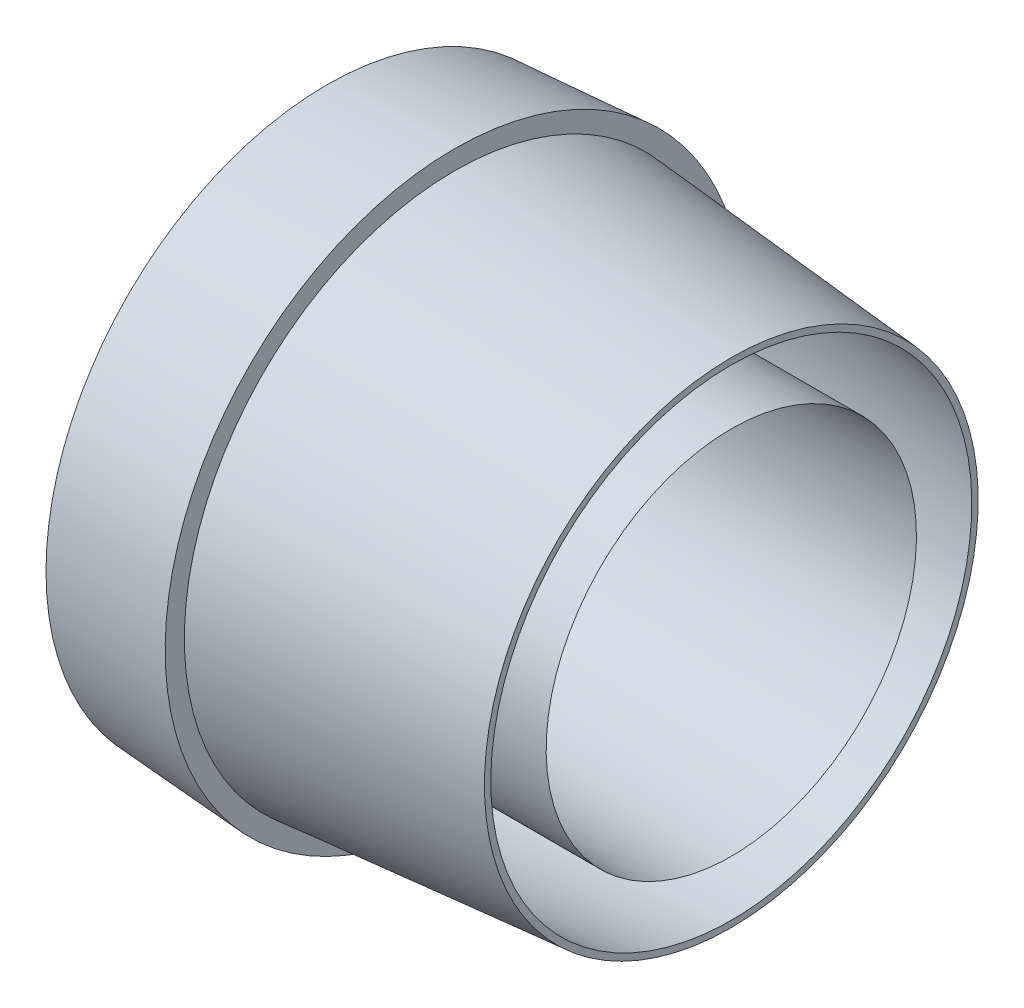
ISO-10303-21;
HEADER;
FILE_DESCRIPTION(('STEP AP214'),'2;1');
FILE_NAME('part.step','',(''),(''),'','','');
FILE_SCHEMA(('AUTOMOTIVE_DESIGN { 1 0 10303 214 1 1 1 1 }'));
ENDSEC;
DATA;
#1=APPLICATION_CONTEXT('core data for automotive mechanical design processes');
#2=APPLICATION_PROTOCOL_DEFINITION('international standard','automotive_design',2000,#1);
#3=PRODUCT_CONTEXT('',#1,'mechanical');
#4=PRODUCT('Part','Part','',(#3));
#5=PRODUCT_RELATED_PRODUCT_CATEGORY('part','',(#4));
#6=PRODUCT_DEFINITION_FORMATION('','',#4);
#7=PRODUCT_DEFINITION_CONTEXT('part definition',#1,'design');
#8=PRODUCT_DEFINITION('design','',#6,#7);
#9=PRODUCT_DEFINITION_SHAPE('','',#8);
#10=(LENGTH_UNIT() NAMED_UNIT(*) SI_UNIT(.MILLI.,.METRE.));
#11=(NAMED_UNIT(*) PLANE_ANGLE_UNIT() SI_UNIT($,.RADIAN.));
#12=(NAMED_UNIT(*) SI_UNIT($,.STERADIAN.) SOLID_ANGLE_UNIT());
#13=UNCERTAINTY_MEASURE_WITH_UNIT(LENGTH_MEASURE(1.E-05),#10,'distance_accuracy_value','');
#14=(GEOMETRIC_REPRESENTATION_CONTEXT(3) GLOBAL_UNCERTAINTY_ASSIGNED_CONTEXT((#13)) GLOBAL_UNIT_ASSIGNED_CONTEXT((#10,
#11,#12)) REPRESENTATION_CONTEXT('',''));
#15=CARTESIAN_POINT('',(0.,0.,0.));
#16=DIRECTION('',(0.,0.,1.));
#17=DIRECTION('',(1.,0.,0.));
#18=AXIS2_PLACEMENT_3D('',#15,#16,#17);
#19=CARTESIAN_POINT('',(3700.,0.,0.));
#20=DIRECTION('',(1.,0.,0.));
#21=DIRECTION('',(0.,0.,-1.));
#22=AXIS2_PLACEMENT_3D('',#19,#20,#21);
#23=CONICAL_SURFACE('',#22,420.,0.0230728278901438);
#24=CARTESIAN_POINT('',(3700.,0.,0.));
#25=DIRECTION('',(-1.,0.,0.));
#26=DIRECTION('',(0.,0.,1.));
#27=AXIS2_PLACEMENT_3D('',#24,#25,#26);
#28=CIRCLE('',#27,420.);
#29=CARTESIAN_POINT('',(3700.,420.,-3.01542614506695E-06));
#30=VERTEX_POINT('',#29);
#31=CARTESIAN_POINT('',(3700.,420.,0.));
#32=VERTEX_POINT('',#31);
#33=EDGE_CURVE('E12',#30,#32,#28,.T.);
#34=ORIENTED_EDGE('',*,*,#33,.T.);
#35=DIRECTION('',(0.999733834114794,0.0230707807872643,0.));
#36=VECTOR('',#35,1.);
#37=CARTESIAN_POINT('',(4350.,435.,0.));
#38=LINE('',#37,#36);
#39=CARTESIAN_POINT('',(4350.,435.,0.));
#40=VERTEX_POINT('',#39);
#41=EDGE_CURVE('E96',#32,#40,#38,.T.);
#42=ORIENTED_EDGE('',*,*,#41,.T.);
#43=CARTESIAN_POINT('',(4350.,0.,0.));
#44=DIRECTION('',(-1.,0.,0.));
#45=DIRECTION('',(0.,0.,1.));
#46=AXIS2_PLACEMENT_3D('',#43,#44,#45);
#47=CIRCLE('',#46,435.);
#48=CARTESIAN_POINT('',(4350.,435.,-3.1231199359622E-06));
#49=VERTEX_POINT('',#48);
#50=EDGE_CURVE('E83',#49,#40,#47,.T.);
#51=ORIENTED_EDGE('',*,*,#50,.F.);
#52=DIRECTION('',(0.999733834114794,0.0230707807872643,-1.65638656126251E-10));
#53=VECTOR('',#52,1.);
#54=CARTESIAN_POINT('',(4350.,435.,-3.1231199359622E-06));
#55=LINE('',#54,#53);
#56=EDGE_CURVE('E105',#30,#49,#55,.T.);
#57=ORIENTED_EDGE('',*,*,#56,.F.);
#58=EDGE_LOOP('',(#34,#42,#51,#57));
#59=FACE_BOUND('',#58,.T.);
#60=ADVANCED_FACE('F49',(#59),#23,.F.);
#61=CARTESIAN_POINT('',(3700.,420.,-3.01542614506695E-06));
#62=DIRECTION('',(1.,0.,0.));
#63=DIRECTION('',(0.,0.,-1.));
#64=AXIS2_PLACEMENT_3D('',#61,#62,#63);
#65=PLANE('',#64);
#66=CARTESIAN_POINT('',(3700.,0.,0.));
#67=DIRECTION('',(-1.,0.,0.));
#68=DIRECTION('',(0.,0.,1.));
#69=AXIS2_PLACEMENT_3D('',#66,#67,#68);
#70=CIRCLE('',#69,435.);
#71=CARTESIAN_POINT('',(3700.,435.,-3.1231199359622E-06));
#72=VERTEX_POINT('',#71);
#73=CARTESIAN_POINT('',(3700.,435.,0.));
#74=VERTEX_POINT('',#73);
#75=EDGE_CURVE('E59',#72,#74,#70,.T.);
#76=ORIENTED_EDGE('',*,*,#75,.T.);
#77=DIRECTION('',(0.,-1.,0.));
#78=VECTOR('',#77,1.);
#79=CARTESIAN_POINT('',(3700.,420.,0.));
#80=LINE('',#79,#78);
#81=EDGE_CURVE('E100',#74,#32,#80,.T.);
#82=ORIENTED_EDGE('',*,*,#81,.T.);
#83=ORIENTED_EDGE('',*,*,#33,.F.);
#84=DIRECTION('',(0.,-1.,7.17958605968322E-09));
#85=VECTOR('',#84,1.);
#86=CARTESIAN_POINT('',(3700.,420.,-3.01542614506695E-06));
#87=LINE('',#86,#85);
#88=EDGE_CURVE('E91',#72,#30,#87,.T.);
#89=ORIENTED_EDGE('',*,*,#88,.F.);
#90=EDGE_LOOP('',(#76,#82,#83,#89));
#91=FACE_BOUND('',#90,.T.);
#92=ADVANCED_FACE('F55',(#91),#65,.F.);
#93=CARTESIAN_POINT('',(0.,0.,0.));
#94=DIRECTION('',(-1.,0.,0.));
#95=DIRECTION('',(0.,0.,1.));
#96=AXIS2_PLACEMENT_3D('',#93,#94,#95);
#97=CYLINDRICAL_SURFACE('',#96,435.);
#98=DIRECTION('',(-1.,0.,0.));
#99=VECTOR('',#98,1.);
#100=CARTESIAN_POINT('',(3700.,435.,-3.1231199359622E-06));
#101=LINE('',#100,#99);
#102=EDGE_CURVE('E86',#49,#72,#101,.T.);
#103=ORIENTED_EDGE('',*,*,#102,.F.);
#104=ORIENTED_EDGE('',*,*,#50,.T.);
#105=DIRECTION('',(-1.,0.,0.));
#106=VECTOR('',#105,1.);
#107=CARTESIAN_POINT('',(3700.,435.,0.));
#108=LINE('',#107,#106);
#109=EDGE_CURVE('E84',#40,#74,#108,.T.);
#110=ORIENTED_EDGE('',*,*,#109,.T.);
#111=ORIENTED_EDGE('',*,*,#75,.F.);
#112=EDGE_LOOP('',(#103,#104,#110,#111));
#113=FACE_BOUND('',#112,.T.);
#114=ADVANCED_FACE('F81',(#113),#97,.T.);
#115=CARTESIAN_POINT('',(0.,0.,0.));
#116=DIRECTION('',(0.,-7.17958605968322E-09,-1.));
#117=DIRECTION('',(-1.,0.,0.));
#118=AXIS2_PLACEMENT_3D('',#115,#116,#117);
#119=PLANE('',#118);
#120=ORIENTED_EDGE('',*,*,#56,.T.);
#121=ORIENTED_EDGE('',*,*,#102,.T.);
#122=ORIENTED_EDGE('',*,*,#88,.T.);
#123=EDGE_LOOP('',(#120,#121,#122));
#124=FACE_BOUND('',#123,.T.);
#125=ADVANCED_FACE('F107',(#124),#119,.F.);
#126=CARTESIAN_POINT('',(0.,0.,0.));
#127=DIRECTION('',(0.,0.,-1.));
#128=DIRECTION('',(-1.,0.,0.));
#129=AXIS2_PLACEMENT_3D('',#126,#127,#128);
#130=PLANE('',#129);
#131=ORIENTED_EDGE('',*,*,#41,.F.);
#132=ORIENTED_EDGE('',*,*,#81,.F.);
#133=ORIENTED_EDGE('',*,*,#109,.F.);
#134=EDGE_LOOP('',(#131,#132,#133));
#135=FACE_BOUND('',#134,.T.);
#136=ADVANCED_FACE('F94',(#135),#130,.T.);
#137=CLOSED_SHELL('',(#60,#92,#114,#125,#136));
#138=MANIFOLD_SOLID_BREP('B2',#137);
#139=CARTESIAN_POINT('',(3700.,0.,0.));
#140=DIRECTION('',(-1.,0.,0.));
#141=DIRECTION('',(0.,0.,1.));
#142=AXIS2_PLACEMENT_3D('',#139,#140,#141);
#143=CONICAL_SURFACE('',#142,620.,0.0844143056755337);
#144=CARTESIAN_POINT('',(3700.,0.,0.));
#145=DIRECTION('',(-1.,0.,0.));
#146=DIRECTION('',(0.,0.,1.));
#147=AXIS2_PLACEMENT_3D('',#144,#145,#146);
#148=CIRCLE('',#147,620.);
#149=CARTESIAN_POINT('',(3700.,620.,-4.4513433570036E-06));
#150=VERTEX_POINT('',#149);
#151=CARTESIAN_POINT('',(3700.,620.,0.));
#152=VERTEX_POINT('',#151);
#153=EDGE_CURVE('E48',#150,#152,#148,.T.);
#154=ORIENTED_EDGE('',*,*,#153,.T.);
#155=DIRECTION('',(0.996439227690749,-0.0843140884969096,0.));
#156=VECTOR('',#155,1.);
#157=CARTESIAN_POINT('',(4350.,565.,0.));
#158=LINE('',#157,#156);
#159=CARTESIAN_POINT('',(4350.,565.,0.));
#160=VERTEX_POINT('',#159);
#161=EDGE_CURVE('E203',#152,#160,#158,.T.);
#162=ORIENTED_EDGE('',*,*,#161,.T.);
#163=CARTESIAN_POINT('',(4350.,0.,0.));
#164=DIRECTION('',(-1.,0.,0.));
#165=DIRECTION('',(0.,0.,1.));
#166=AXIS2_PLACEMENT_3D('',#163,#164,#165);
#167=CIRCLE('',#166,565.);
#168=CARTESIAN_POINT('',(4350.,565.,-4.05646612372102E-06));
#169=VERTEX_POINT('',#168);
#170=EDGE_CURVE('E190',#169,#160,#167,.T.);
#171=ORIENTED_EDGE('',*,*,#170,.F.);
#172=DIRECTION('',(0.996439227690749,-0.0843140884969096,6.0534025440731E-10));
#173=VECTOR('',#172,1.);
#174=CARTESIAN_POINT('',(4350.,565.,-4.05646612372102E-06));
#175=LINE('',#174,#173);
#176=EDGE_CURVE('E211',#150,#169,#175,.T.);
#177=ORIENTED_EDGE('',*,*,#176,.F.);
#178=EDGE_LOOP('',(#154,#162,#171,#177));
#179=FACE_BOUND('',#178,.T.);
#180=ADVANCED_FACE('F150',(#179),#143,.F.);
#181=CARTESIAN_POINT('',(3700.,620.,-4.4513433570036E-06));
#182=DIRECTION('',(1.,0.,0.));
#183=DIRECTION('',(0.,0.,-1.));
#184=AXIS2_PLACEMENT_3D('',#181,#182,#183);
#185=PLANE('',#184);
#186=CARTESIAN_POINT('',(3700.,0.,0.));
#187=DIRECTION('',(-1.,0.,0.));
#188=DIRECTION('',(0.,0.,1.));
#189=AXIS2_PLACEMENT_3D('',#186,#187,#188);
#190=CIRCLE('',#189,635.);
#191=CARTESIAN_POINT('',(3700.,635.,-4.55903714789885E-06));
#192=VERTEX_POINT('',#191);
#193=CARTESIAN_POINT('',(3700.,635.,0.));
#194=VERTEX_POINT('',#193);
#195=EDGE_CURVE('E151',#192,#194,#190,.T.);
#196=ORIENTED_EDGE('',*,*,#195,.T.);
#197=DIRECTION('',(0.,-1.,0.));
#198=VECTOR('',#197,1.);
#199=CARTESIAN_POINT('',(3700.,620.,0.));
#200=LINE('',#199,#198);
#201=EDGE_CURVE('E213',#194,#152,#200,.T.);
#202=ORIENTED_EDGE('',*,*,#201,.T.);
#203=ORIENTED_EDGE('',*,*,#153,.F.);
#204=DIRECTION('',(0.,-1.,7.17958605968322E-09));
#205=VECTOR('',#204,1.);
#206=CARTESIAN_POINT('',(3700.,620.,-4.4513433570036E-06));
#207=LINE('',#206,#205);
#208=EDGE_CURVE('E199',#192,#150,#207,.T.);
#209=ORIENTED_EDGE('',*,*,#208,.F.);
#210=EDGE_LOOP('',(#196,#202,#203,#209));
#211=FACE_BOUND('',#210,.T.);
#212=ADVANCED_FACE('F146',(#211),#185,.F.);
#213=CARTESIAN_POINT('',(4350.,0.,0.));
#214=DIRECTION('',(-1.,0.,0.));
#215=DIRECTION('',(0.,0.,1.));
#216=AXIS2_PLACEMENT_3D('',#213,#214,#215);
#217=CONICAL_SURFACE('',#216,580.,0.0844143056755335);
#218=CARTESIAN_POINT('',(4350.,0.,0.));
#219=DIRECTION('',(-1.,0.,0.));
#220=DIRECTION('',(0.,0.,1.));
#221=AXIS2_PLACEMENT_3D('',#218,#219,#220);
#222=CIRCLE('',#221,580.);
#223=CARTESIAN_POINT('',(4350.,580.,-4.16415991461627E-06));
#224=VERTEX_POINT('',#223);
#225=CARTESIAN_POINT('',(4350.,580.,0.));
#226=VERTEX_POINT('',#225);
#227=EDGE_CURVE('E198',#224,#226,#222,.T.);
#228=ORIENTED_EDGE('',*,*,#227,.T.);
#229=DIRECTION('',(-0.996439227690749,0.0843140884969095,0.));
#230=VECTOR('',#229,1.);
#231=CARTESIAN_POINT('',(3700.,635.,0.));
#232=LINE('',#231,#230);
#233=EDGE_CURVE('E207',#226,#194,#232,.T.);
#234=ORIENTED_EDGE('',*,*,#233,.T.);
#235=ORIENTED_EDGE('',*,*,#195,.F.);
#236=DIRECTION('',(-0.996439227690749,0.0843140884969095,-6.05340254407309E-10));
#237=VECTOR('',#236,1.);
#238=CARTESIAN_POINT('',(3700.,635.,-4.55903714789885E-06));
#239=LINE('',#238,#237);
#240=EDGE_CURVE('E218',#224,#192,#239,.T.);
#241=ORIENTED_EDGE('',*,*,#240,.F.);
#242=EDGE_LOOP('',(#228,#234,#235,#241));
#243=FACE_BOUND('',#242,.T.);
#244=ADVANCED_FACE('F219',(#243),#217,.T.);
#245=CARTESIAN_POINT('',(4350.,580.,-4.16415991461627E-06));
#246=DIRECTION('',(-1.,0.,0.));
#247=DIRECTION('',(0.,0.,1.));
#248=AXIS2_PLACEMENT_3D('',#245,#246,#247);
#249=PLANE('',#248);
#250=DIRECTION('',(0.,1.,-7.17958605968322E-09));
#251=VECTOR('',#250,1.);
#252=CARTESIAN_POINT('',(4350.,580.,-4.16415991461627E-06));
#253=LINE('',#252,#251);
#254=EDGE_CURVE('E194',#169,#224,#253,.T.);
#255=ORIENTED_EDGE('',*,*,#254,.F.);
#256=ORIENTED_EDGE('',*,*,#170,.T.);
#257=DIRECTION('',(0.,1.,0.));
#258=VECTOR('',#257,1.);
#259=CARTESIAN_POINT('',(4350.,580.,0.));
#260=LINE('',#259,#258);
#261=EDGE_CURVE('E189',#160,#226,#260,.T.);
#262=ORIENTED_EDGE('',*,*,#261,.T.);
#263=ORIENTED_EDGE('',*,*,#227,.F.);
#264=EDGE_LOOP('',(#255,#256,#262,#263));
#265=FACE_BOUND('',#264,.T.);
#266=ADVANCED_FACE('F188',(#265),#249,.F.);
#267=CARTESIAN_POINT('',(0.,0.,0.));
#268=DIRECTION('',(0.,-7.17958605968322E-09,-1.));
#269=DIRECTION('',(-1.,0.,0.));
#270=AXIS2_PLACEMENT_3D('',#267,#268,#269);
#271=PLANE('',#270);
#272=ORIENTED_EDGE('',*,*,#176,.T.);
#273=ORIENTED_EDGE('',*,*,#254,.T.);
#274=ORIENTED_EDGE('',*,*,#240,.T.);
#275=ORIENTED_EDGE('',*,*,#208,.T.);
#276=EDGE_LOOP('',(#272,#273,#274,#275));
#277=FACE_BOUND('',#276,.T.);
#278=ADVANCED_FACE('F221',(#277),#271,.F.);
#279=CARTESIAN_POINT('',(0.,0.,0.));
#280=DIRECTION('',(0.,0.,-1.));
#281=DIRECTION('',(-1.,0.,0.));
#282=AXIS2_PLACEMENT_3D('',#279,#280,#281);
#283=PLANE('',#282);
#284=ORIENTED_EDGE('',*,*,#161,.F.);
#285=ORIENTED_EDGE('',*,*,#201,.F.);
#286=ORIENTED_EDGE('',*,*,#233,.F.);
#287=ORIENTED_EDGE('',*,*,#261,.F.);
#288=EDGE_LOOP('',(#284,#285,#286,#287));
#289=FACE_BOUND('',#288,.T.);
#290=ADVANCED_FACE('F201',(#289),#283,.T.);
#291=CLOSED_SHELL('',(#180,#212,#244,#266,#278,#290));
#292=MANIFOLD_SOLID_BREP('B6',#291);
#293=CARTESIAN_POINT('',(3400.,0.,0.));
#294=DIRECTION('',(1.,0.,0.));
#295=DIRECTION('',(0.,0.,-1.));
#296=AXIS2_PLACEMENT_3D('',#293,#294,#295);
#297=CONICAL_SURFACE('',#296,350.,0.099668652491162);
#298=CARTESIAN_POINT('',(3400.,0.,0.));
#299=DIRECTION('',(-1.,0.,0.));
#300=DIRECTION('',(0.,0.,1.));
#301=AXIS2_PLACEMENT_3D('',#298,#299,#300);
#302=CIRCLE('',#301,350.);
#303=CARTESIAN_POINT('',(3400.,350.,-2.51285512088913E-06));
#304=VERTEX_POINT('',#303);
#305=CARTESIAN_POINT('',(3400.,350.,0.));
#306=VERTEX_POINT('',#305);
#307=EDGE_CURVE('E144',#304,#306,#302,.T.);
#308=ORIENTED_EDGE('',*,*,#307,.T.);
#309=DIRECTION('',(0.995037190209989,0.0995037190209989,0.));
#310=VECTOR('',#309,1.);
#311=CARTESIAN_POINT('',(3700.,380.,0.));
#312=LINE('',#311,#310);
#313=CARTESIAN_POINT('',(3700.,380.,0.));
#314=VERTEX_POINT('',#313);
#315=EDGE_CURVE('E317',#306,#314,#312,.T.);
#316=ORIENTED_EDGE('',*,*,#315,.T.);
#317=CARTESIAN_POINT('',(3700.,0.,0.));
#318=DIRECTION('',(-1.,0.,0.));
#319=DIRECTION('',(0.,0.,1.));
#320=AXIS2_PLACEMENT_3D('',#317,#318,#319);
#321=CIRCLE('',#320,380.);
#322=CARTESIAN_POINT('',(3700.,380.,-2.72824270267963E-06));
#323=VERTEX_POINT('',#322);
#324=EDGE_CURVE('E303',#323,#314,#321,.T.);
#325=ORIENTED_EDGE('',*,*,#324,.F.);
#326=DIRECTION('',(0.995037190209989,0.0995037190209989,-7.143955139698E-10));
#327=VECTOR('',#326,1.);
#328=CARTESIAN_POINT('',(3700.,380.,-2.72824270267963E-06));
#329=LINE('',#328,#327);
#330=EDGE_CURVE('E330',#304,#323,#329,.T.);
#331=ORIENTED_EDGE('',*,*,#330,.F.);
#332=EDGE_LOOP('',(#308,#316,#325,#331));
#333=FACE_BOUND('',#332,.T.);
#334=ADVANCED_FACE('F263',(#333),#297,.F.);
#335=CARTESIAN_POINT('',(3400.,350.,-2.51285512088913E-06));
#336=DIRECTION('',(1.,0.,0.));
#337=DIRECTION('',(0.,0.,-1.));
#338=AXIS2_PLACEMENT_3D('',#335,#336,#337);
#339=PLANE('',#338);
#340=CARTESIAN_POINT('',(3400.,0.,0.));
#341=DIRECTION('',(-1.,0.,0.));
#342=DIRECTION('',(0.,0.,1.));
#343=AXIS2_PLACEMENT_3D('',#340,#341,#342);
#344=CIRCLE('',#343,660.);
#345=CARTESIAN_POINT('',(3400.,660.,-4.73852679939093E-06));
#346=VERTEX_POINT('',#345);
#347=CARTESIAN_POINT('',(3400.,660.,0.));
#348=VERTEX_POINT('',#347);
#349=EDGE_CURVE('E267',#346,#348,#344,.T.);
#350=ORIENTED_EDGE('',*,*,#349,.T.);
#351=DIRECTION('',(0.,-1.,0.));
#352=VECTOR('',#351,1.);
#353=CARTESIAN_POINT('',(3400.,350.,0.));
#354=LINE('',#353,#352);
#355=EDGE_CURVE('E324',#348,#306,#354,.T.);
#356=ORIENTED_EDGE('',*,*,#355,.T.);
#357=ORIENTED_EDGE('',*,*,#307,.F.);
#358=DIRECTION('',(0.,-1.,7.17958605968322E-09));
#359=VECTOR('',#358,1.);
#360=CARTESIAN_POINT('',(3400.,350.,-2.51285512088913E-06));
#361=LINE('',#360,#359);
#362=EDGE_CURVE('E313',#346,#304,#361,.T.);
#363=ORIENTED_EDGE('',*,*,#362,.F.);
#364=EDGE_LOOP('',(#350,#356,#357,#363));
#365=FACE_BOUND('',#364,.T.);
#366=ADVANCED_FACE('F261',(#365),#339,.F.);
#367=CARTESIAN_POINT('',(3700.,0.,0.));
#368=DIRECTION('',(1.,0.,0.));
#369=DIRECTION('',(0.,0.,-1.));
#370=AXIS2_PLACEMENT_3D('',#367,#368,#369);
#371=CONICAL_SURFACE('',#370,680.,0.0665681637758238);
#372=CARTESIAN_POINT('',(3700.,0.,0.));
#373=DIRECTION('',(-1.,0.,0.));
#374=DIRECTION('',(0.,0.,1.));
#375=AXIS2_PLACEMENT_3D('',#372,#373,#374);
#376=CIRCLE('',#375,680.);
#377=CARTESIAN_POINT('',(3700.,680.,-4.88211852058459E-06));
#378=VERTEX_POINT('',#377);
#379=CARTESIAN_POINT('',(3700.,680.,0.));
#380=VERTEX_POINT('',#379);
#381=EDGE_CURVE('E315',#378,#380,#376,.T.);
#382=ORIENTED_EDGE('',*,*,#381,.T.);
#383=DIRECTION('',(-0.997785157856609,-0.0665190105237739,0.));
#384=VECTOR('',#383,1.);
#385=CARTESIAN_POINT('',(3400.,660.,0.));
#386=LINE('',#385,#384);
#387=EDGE_CURVE('E319',#380,#348,#386,.T.);
#388=ORIENTED_EDGE('',*,*,#387,.T.);
#389=ORIENTED_EDGE('',*,*,#349,.F.);
#390=DIRECTION('',(-0.997785157856609,-0.0665190105237739,4.77578960660409E-10));
#391=VECTOR('',#390,1.);
#392=CARTESIAN_POINT('',(3400.,660.,-4.73852679939093E-06));
#393=LINE('',#392,#391);
#394=EDGE_CURVE('E328',#378,#346,#393,.T.);
#395=ORIENTED_EDGE('',*,*,#394,.F.);
#396=EDGE_LOOP('',(#382,#388,#389,#395));
#397=FACE_BOUND('',#396,.T.);
#398=ADVANCED_FACE('F333',(#397),#371,.T.);
#399=CARTESIAN_POINT('',(3700.,680.,-4.88211852058459E-06));
#400=DIRECTION('',(-1.,0.,0.));
#401=DIRECTION('',(0.,0.,1.));
#402=AXIS2_PLACEMENT_3D('',#399,#400,#401);
#403=PLANE('',#402);
#404=DIRECTION('',(0.,1.,-7.17958605968322E-09));
#405=VECTOR('',#404,1.);
#406=CARTESIAN_POINT('',(3700.,680.,-4.88211852058459E-06));
#407=LINE('',#406,#405);
#408=EDGE_CURVE('E310',#323,#378,#407,.T.);
#409=ORIENTED_EDGE('',*,*,#408,.F.);
#410=ORIENTED_EDGE('',*,*,#324,.T.);
#411=DIRECTION('',(0.,1.,0.));
#412=VECTOR('',#411,1.);
#413=CARTESIAN_POINT('',(3700.,680.,0.));
#414=LINE('',#413,#412);
#415=EDGE_CURVE('E305',#314,#380,#414,.T.);
#416=ORIENTED_EDGE('',*,*,#415,.T.);
#417=ORIENTED_EDGE('',*,*,#381,.F.);
#418=EDGE_LOOP('',(#409,#410,#416,#417));
#419=FACE_BOUND('',#418,.T.);
#420=ADVANCED_FACE('F301',(#419),#403,.F.);
#421=CARTESIAN_POINT('',(0.,0.,0.));
#422=DIRECTION('',(0.,-7.17958605968322E-09,-1.));
#423=DIRECTION('',(-1.,0.,0.));
#424=AXIS2_PLACEMENT_3D('',#421,#422,#423);
#425=PLANE('',#424);
#426=ORIENTED_EDGE('',*,*,#330,.T.);
#427=ORIENTED_EDGE('',*,*,#408,.T.);
#428=ORIENTED_EDGE('',*,*,#394,.T.);
#429=ORIENTED_EDGE('',*,*,#362,.T.);
#430=EDGE_LOOP('',(#426,#427,#428,#429));
#431=FACE_BOUND('',#430,.T.);
#432=ADVANCED_FACE('F331',(#431),#425,.F.);
#433=CARTESIAN_POINT('',(0.,0.,0.));
#434=DIRECTION('',(0.,0.,-1.));
#435=DIRECTION('',(-1.,0.,0.));
#436=AXIS2_PLACEMENT_3D('',#433,#434,#435);
#437=PLANE('',#436);
#438=ORIENTED_EDGE('',*,*,#315,.F.);
#439=ORIENTED_EDGE('',*,*,#355,.F.);
#440=ORIENTED_EDGE('',*,*,#387,.F.);
#441=ORIENTED_EDGE('',*,*,#415,.F.);
#442=EDGE_LOOP('',(#438,#439,#440,#441));
#443=FACE_BOUND('',#442,.T.);
#444=ADVANCED_FACE('F320',(#443),#437,.T.);
#445=CLOSED_SHELL('',(#334,#366,#398,#420,#432,#444));
#446=MANIFOLD_SOLID_BREP('B45',#445);
#447=ADVANCED_BREP_SHAPE_REPRESENTATION('',(#18,#138,#292,#446),#14);
#448=SHAPE_DEFINITION_REPRESENTATION(#9,#447);
ENDSEC;
END-ISO-10303-21;
